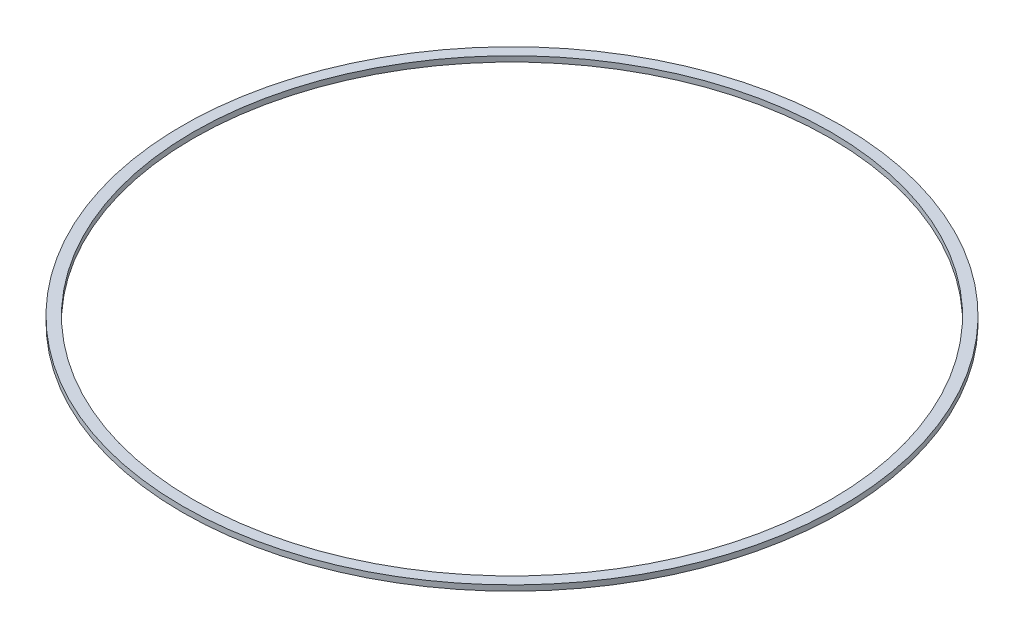
ISO-10303-21;
HEADER;
FILE_DESCRIPTION(('STEP AP214'),'2;1');
FILE_NAME('part.step','',(''),(''),'','','');
FILE_SCHEMA(('AUTOMOTIVE_DESIGN { 1 0 10303 214 1 1 1 1 }'));
ENDSEC;
DATA;
#1=APPLICATION_CONTEXT('core data for automotive mechanical design processes');
#2=APPLICATION_PROTOCOL_DEFINITION('international standard','automotive_design',2000,#1);
#3=PRODUCT_CONTEXT('',#1,'mechanical');
#4=PRODUCT('Part','Part','',(#3));
#5=PRODUCT_RELATED_PRODUCT_CATEGORY('part','',(#4));
#6=PRODUCT_DEFINITION_FORMATION('','',#4);
#7=PRODUCT_DEFINITION_CONTEXT('part definition',#1,'design');
#8=PRODUCT_DEFINITION('design','',#6,#7);
#9=PRODUCT_DEFINITION_SHAPE('','',#8);
#10=(LENGTH_UNIT() NAMED_UNIT(*) SI_UNIT(.MILLI.,.METRE.));
#11=(NAMED_UNIT(*) PLANE_ANGLE_UNIT() SI_UNIT($,.RADIAN.));
#12=(NAMED_UNIT(*) SI_UNIT($,.STERADIAN.) SOLID_ANGLE_UNIT());
#13=UNCERTAINTY_MEASURE_WITH_UNIT(LENGTH_MEASURE(1.E-05),#10,'distance_accuracy_value','');
#14=(GEOMETRIC_REPRESENTATION_CONTEXT(3) GLOBAL_UNCERTAINTY_ASSIGNED_CONTEXT((#13)) GLOBAL_UNIT_ASSIGNED_CONTEXT((#10,
#11,#12)) REPRESENTATION_CONTEXT('',''));
#15=CARTESIAN_POINT('',(0.,0.,0.));
#16=DIRECTION('',(0.,0.,1.));
#17=DIRECTION('',(1.,0.,0.));
#18=AXIS2_PLACEMENT_3D('',#15,#16,#17);
#19=CARTESIAN_POINT('',(-11.5056756172422,2.26567820977487,0.));
#20=DIRECTION('',(0.,1.,0.));
#21=DIRECTION('',(0.,0.,1.));
#22=AXIS2_PLACEMENT_3D('',#19,#20,#21);
#23=CYLINDRICAL_SURFACE('',#22,29.);
#24=CARTESIAN_POINT('',(-11.5056756172422,0.357142857142856,0.));
#25=DIRECTION('',(0.,1.,0.));
#26=DIRECTION('',(0.,0.,1.));
#27=AXIS2_PLACEMENT_3D('',#24,#25,#26);
#28=CIRCLE('',#27,29.);
#29=CARTESIAN_POINT('',(-11.5056756172422,0.357142857142856,29.));
#30=VERTEX_POINT('',#29);
#31=EDGE_CURVE('E10',#30,#30,#28,.T.);
#32=ORIENTED_EDGE('',*,*,#31,.F.);
#33=EDGE_LOOP('',(#32));
#34=FACE_BOUND('',#33,.T.);
#35=CARTESIAN_POINT('',(-11.5056756172422,0.857142857142856,0.));
#36=DIRECTION('',(0.,1.,0.));
#37=DIRECTION('',(0.,0.,1.));
#38=AXIS2_PLACEMENT_3D('',#35,#36,#37);
#39=CIRCLE('',#38,29.);
#40=CARTESIAN_POINT('',(-11.5056756172422,0.857142857142856,29.));
#41=VERTEX_POINT('',#40);
#42=EDGE_CURVE('E54',#41,#41,#39,.T.);
#43=ORIENTED_EDGE('',*,*,#42,.T.);
#44=EDGE_LOOP('',(#43));
#45=FACE_BOUND('',#44,.T.);
#46=ADVANCED_FACE('F37',(#34,#45),#23,.F.);
#47=CARTESIAN_POINT('',(17.4943243827578,0.357142857142856,0.));
#48=DIRECTION('',(0.,1.,0.));
#49=DIRECTION('',(0.,0.,1.));
#50=AXIS2_PLACEMENT_3D('',#47,#48,#49);
#51=PLANE('',#50);
#52=CARTESIAN_POINT('',(-11.5056756172422,0.357142857142856,0.));
#53=DIRECTION('',(0.,1.,0.));
#54=DIRECTION('',(0.,0.,1.));
#55=AXIS2_PLACEMENT_3D('',#52,#53,#54);
#56=CIRCLE('',#55,30.);
#57=CARTESIAN_POINT('',(-11.5056756172422,0.357142857142856,30.));
#58=VERTEX_POINT('',#57);
#59=EDGE_CURVE('E44',#58,#58,#56,.T.);
#60=ORIENTED_EDGE('',*,*,#59,.F.);
#61=EDGE_LOOP('',(#60));
#62=FACE_BOUND('',#61,.T.);
#63=ORIENTED_EDGE('',*,*,#31,.T.);
#64=EDGE_LOOP('',(#63));
#65=FACE_BOUND('',#64,.T.);
#66=ADVANCED_FACE('F70',(#62,#65),#51,.F.);
#67=CARTESIAN_POINT('',(-11.5056756172422,2.26567820977487,0.));
#68=DIRECTION('',(0.,1.,0.));
#69=DIRECTION('',(0.,0.,1.));
#70=AXIS2_PLACEMENT_3D('',#67,#68,#69);
#71=CYLINDRICAL_SURFACE('',#70,30.);
#72=CARTESIAN_POINT('',(-11.5056756172422,0.857142857142856,0.));
#73=DIRECTION('',(0.,1.,0.));
#74=DIRECTION('',(0.,0.,1.));
#75=AXIS2_PLACEMENT_3D('',#72,#73,#74);
#76=CIRCLE('',#75,30.);
#77=CARTESIAN_POINT('',(-11.5056756172422,0.857142857142856,30.));
#78=VERTEX_POINT('',#77);
#79=EDGE_CURVE('E49',#78,#78,#76,.T.);
#80=ORIENTED_EDGE('',*,*,#79,.F.);
#81=EDGE_LOOP('',(#80));
#82=FACE_BOUND('',#81,.T.);
#83=ORIENTED_EDGE('',*,*,#59,.T.);
#84=EDGE_LOOP('',(#83));
#85=FACE_BOUND('',#84,.T.);
#86=ADVANCED_FACE('F65',(#82,#85),#71,.T.);
#87=CARTESIAN_POINT('',(17.4943243827578,0.857142857142856,0.));
#88=DIRECTION('',(0.,-1.,0.));
#89=DIRECTION('',(0.,0.,-1.));
#90=AXIS2_PLACEMENT_3D('',#87,#88,#89);
#91=PLANE('',#90);
#92=ORIENTED_EDGE('',*,*,#42,.F.);
#93=EDGE_LOOP('',(#92));
#94=FACE_BOUND('',#93,.T.);
#95=ORIENTED_EDGE('',*,*,#79,.T.);
#96=EDGE_LOOP('',(#95));
#97=FACE_BOUND('',#96,.T.);
#98=ADVANCED_FACE('F62',(#94,#97),#91,.F.);
#99=CLOSED_SHELL('',(#46,#66,#86,#98));
#100=MANIFOLD_SOLID_BREP('B2',#99);
#101=ADVANCED_BREP_SHAPE_REPRESENTATION('',(#18,#100),#14);
#102=SHAPE_DEFINITION_REPRESENTATION(#9,#101);
ENDSEC;
END-ISO-10303-21;
